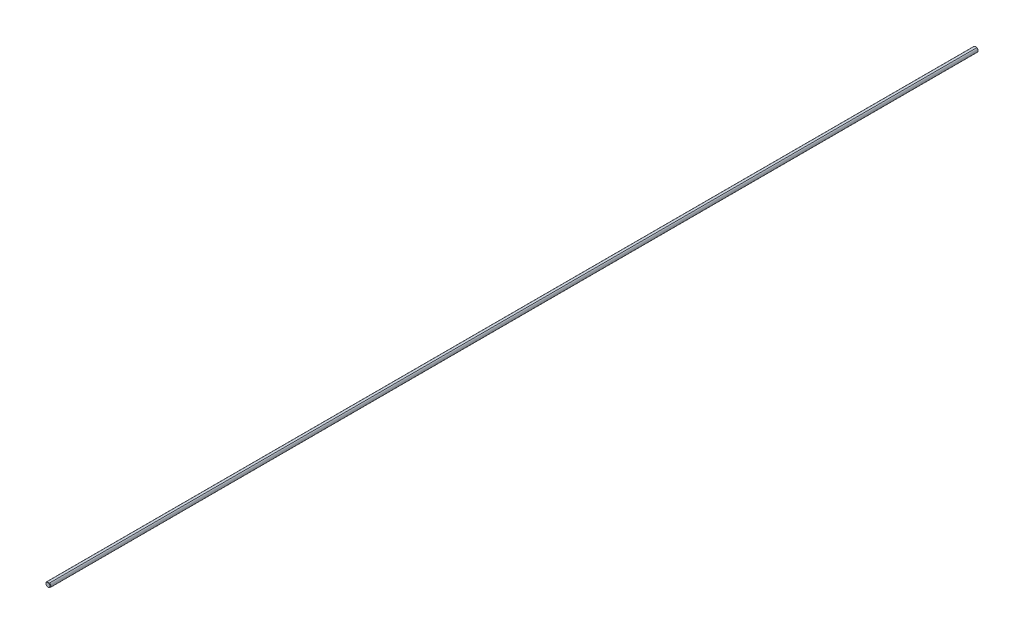
ISO-10303-21;
HEADER;
FILE_DESCRIPTION(('STEP AP214'),'2;1');
FILE_NAME('part.step','',(''),(''),'','','');
FILE_SCHEMA(('AUTOMOTIVE_DESIGN { 1 0 10303 214 1 1 1 1 }'));
ENDSEC;
DATA;
#1=APPLICATION_CONTEXT('core data for automotive mechanical design processes');
#2=APPLICATION_PROTOCOL_DEFINITION('international standard','automotive_design',2000,#1);
#3=PRODUCT_CONTEXT('',#1,'mechanical');
#4=PRODUCT('Part','Part','',(#3));
#5=PRODUCT_RELATED_PRODUCT_CATEGORY('part','',(#4));
#6=PRODUCT_DEFINITION_FORMATION('','',#4);
#7=PRODUCT_DEFINITION_CONTEXT('part definition',#1,'design');
#8=PRODUCT_DEFINITION('design','',#6,#7);
#9=PRODUCT_DEFINITION_SHAPE('','',#8);
#10=(LENGTH_UNIT() NAMED_UNIT(*) SI_UNIT(.MILLI.,.METRE.));
#11=(NAMED_UNIT(*) PLANE_ANGLE_UNIT() SI_UNIT($,.RADIAN.));
#12=(NAMED_UNIT(*) SI_UNIT($,.STERADIAN.) SOLID_ANGLE_UNIT());
#13=UNCERTAINTY_MEASURE_WITH_UNIT(LENGTH_MEASURE(1.E-05),#10,'distance_accuracy_value','');
#14=(GEOMETRIC_REPRESENTATION_CONTEXT(3) GLOBAL_UNCERTAINTY_ASSIGNED_CONTEXT((#13)) GLOBAL_UNIT_ASSIGNED_CONTEXT((#10,
#11,#12)) REPRESENTATION_CONTEXT('',''));
#15=CARTESIAN_POINT('',(0.,0.,0.));
#16=DIRECTION('',(0.,0.,1.));
#17=DIRECTION('',(1.,0.,0.));
#18=AXIS2_PLACEMENT_3D('',#15,#16,#17);
#19=CARTESIAN_POINT('',(0.,0.,609.6));
#20=DIRECTION('',(0.,0.,-1.));
#21=DIRECTION('',(-1.,0.,0.));
#22=AXIS2_PLACEMENT_3D('',#19,#20,#21);
#23=CYLINDRICAL_SURFACE('',#22,3.175);
#24=CARTESIAN_POINT('',(0.,0.,608.965));
#25=DIRECTION('',(0.,0.,1.));
#26=DIRECTION('',(1.,0.,0.));
#27=AXIS2_PLACEMENT_3D('',#24,#25,#26);
#28=CIRCLE('',#27,3.175);
#29=CARTESIAN_POINT('',(1.5875,2.74963065701559,608.965));
#30=VERTEX_POINT('',#29);
#31=CARTESIAN_POINT('',(-1.5875,2.74963065701559,608.965));
#32=VERTEX_POINT('',#31);
#33=EDGE_CURVE('E72',#30,#32,#28,.F.);
#34=ORIENTED_EDGE('',*,*,#33,.T.);
#35=DIRECTION('',(0.,0.,1.));
#36=VECTOR('',#35,1.);
#37=CARTESIAN_POINT('',(-1.5875,2.74963065701559,-609.6));
#38=LINE('',#37,#36);
#39=CARTESIAN_POINT('',(-1.5875,2.74963065701559,-608.964999999999));
#40=VERTEX_POINT('',#39);
#41=EDGE_CURVE('E50',#40,#32,#38,.T.);
#42=ORIENTED_EDGE('',*,*,#41,.F.);
#43=CARTESIAN_POINT('',(0.,0.,-608.964999999999));
#44=DIRECTION('',(0.,0.,1.));
#45=DIRECTION('',(1.,0.,0.));
#46=AXIS2_PLACEMENT_3D('',#43,#44,#45);
#47=CIRCLE('',#46,3.175);
#48=CARTESIAN_POINT('',(1.5875,2.74963065701559,-608.964999999999));
#49=VERTEX_POINT('',#48);
#50=EDGE_CURVE('E71',#40,#49,#47,.T.);
#51=ORIENTED_EDGE('',*,*,#50,.T.);
#52=DIRECTION('',(0.,0.,1.));
#53=VECTOR('',#52,1.);
#54=CARTESIAN_POINT('',(1.5875,2.74963065701559,-609.6));
#55=LINE('',#54,#53);
#56=EDGE_CURVE('E60',#49,#30,#55,.T.);
#57=ORIENTED_EDGE('',*,*,#56,.T.);
#58=EDGE_LOOP('',(#34,#42,#51,#57));
#59=FACE_BOUND('',#58,.T.);
#60=ADVANCED_FACE('F31',(#59),#23,.T.);
#61=CARTESIAN_POINT('',(0.,0.,609.6));
#62=DIRECTION('',(0.,0.,1.));
#63=DIRECTION('',(1.,0.,0.));
#64=AXIS2_PLACEMENT_3D('',#61,#62,#63);
#65=PLANE('',#64);
#66=CARTESIAN_POINT('',(0.,0.,609.6));
#67=DIRECTION('',(0.,0.,1.));
#68=DIRECTION('',(1.,0.,0.));
#69=AXIS2_PLACEMENT_3D('',#66,#67,#68);
#70=CIRCLE('',#69,2.54000000000043);
#71=CARTESIAN_POINT('',(2.54000000000043,0.,609.6));
#72=VERTEX_POINT('',#71);
#73=EDGE_CURVE('E44',#72,#72,#70,.T.);
#74=ORIENTED_EDGE('',*,*,#73,.T.);
#75=EDGE_LOOP('',(#74));
#76=FACE_BOUND('',#75,.T.);
#77=ADVANCED_FACE('F82',(#76),#65,.T.);
#78=CARTESIAN_POINT('',(0.,0.,-609.6));
#79=DIRECTION('',(0.,0.,1.));
#80=DIRECTION('',(1.,0.,0.));
#81=AXIS2_PLACEMENT_3D('',#78,#79,#80);
#82=PLANE('',#81);
#83=CARTESIAN_POINT('',(0.,0.,-609.6));
#84=DIRECTION('',(0.,0.,1.));
#85=DIRECTION('',(1.,0.,0.));
#86=AXIS2_PLACEMENT_3D('',#83,#84,#85);
#87=CIRCLE('',#86,2.53999999999932);
#88=CARTESIAN_POINT('',(2.53999999999932,0.,-609.6));
#89=VERTEX_POINT('',#88);
#90=EDGE_CURVE('E74',#89,#89,#87,.F.);
#91=ORIENTED_EDGE('',*,*,#90,.T.);
#92=EDGE_LOOP('',(#91));
#93=FACE_BOUND('',#92,.T.);
#94=ADVANCED_FACE('F90',(#93),#82,.F.);
#95=CARTESIAN_POINT('',(0.,0.,-608.964999999999));
#96=DIRECTION('',(0.,0.,1.));
#97=DIRECTION('',(1.,0.,0.));
#98=AXIS2_PLACEMENT_3D('',#95,#96,#97);
#99=CONICAL_SURFACE('',#98,3.175,0.785398163397331);
#100=CARTESIAN_POINT('',(-3.22896135223676,2.74963065701559,-607.898931718983));
#101=CARTESIAN_POINT('',(-3.15061649550055,2.74963065701559,-607.958566524545));
#102=CARTESIAN_POINT('',(-3.07184009651217,2.74963065701559,-608.017643482024));
#103=CARTESIAN_POINT('',(-2.91325130568777,2.74963065701559,-608.134429717618));
#104=CARTESIAN_POINT('',(-2.83343866506254,2.74963065701559,-608.192138657525));
#105=CARTESIAN_POINT('',(-2.6720206285271,2.74963065701559,-608.306347547804));
#106=CARTESIAN_POINT('',(-2.59040613970394,2.74963065701559,-608.362834689536));
#107=CARTESIAN_POINT('',(-2.42580311622133,2.74963065701559,-608.473763514334));
#108=CARTESIAN_POINT('',(-2.34281467809305,2.74963065701559,-608.528205340228));
#109=CARTESIAN_POINT('',(-2.17021447787204,2.74963065701559,-608.637773871165));
#110=CARTESIAN_POINT('',(-2.08050398524172,2.74963065701559,-608.692745835339));
#111=CARTESIAN_POINT('',(-1.89900904678674,2.74963065701559,-608.799146993197));
#112=CARTESIAN_POINT('',(-1.80722487525617,2.74963065701559,-608.850576651834));
#113=CARTESIAN_POINT('',(-1.62153760368914,2.74963065701559,-608.948814805051));
#114=CARTESIAN_POINT('',(-1.52764140922482,2.74963065701559,-608.995636250176));
#115=CARTESIAN_POINT('',(-1.3372470657209,2.74963065701559,-609.08360081534));
#116=CARTESIAN_POINT('',(-1.24075014112698,2.74963065701559,-609.124746553593));
#117=CARTESIAN_POINT('',(-1.0536474276074,2.74963065701559,-609.19655643723));
#118=CARTESIAN_POINT('',(-0.963276425588572,2.74963065701559,-609.227826043973));
#119=CARTESIAN_POINT('',(-0.780303735161089,2.74963065701559,-609.28312318735));
#120=CARTESIAN_POINT('',(-0.687701898779481,2.74963065701559,-609.307150242144));
#121=CARTESIAN_POINT('',(-0.502391431282919,2.74963065701559,-609.34628829084));
#122=CARTESIAN_POINT('',(-0.409716445146837,2.74963065701559,-609.361555954748));
#123=CARTESIAN_POINT('',(-0.223306330685383,2.74963065701559,-609.382868842029));
#124=CARTESIAN_POINT('',(-0.129571403437506,2.74963065701559,-609.388915786013));
#125=CARTESIAN_POINT('',(0.0543357559014986,2.74963065701559,-609.391309485248));
#126=CARTESIAN_POINT('',(0.144503242552168,2.74963065701559,-609.388028086227));
#127=CARTESIAN_POINT('',(0.324095543573175,2.74963065701559,-609.372781771963));
#128=CARTESIAN_POINT('',(0.413520286896612,2.74963065701559,-609.360816035481));
#129=CARTESIAN_POINT('',(0.592496066023778,2.74963065701559,-609.328661523536));
#130=CARTESIAN_POINT('',(0.682021177378701,2.74963065701559,-609.308330580175));
#131=CARTESIAN_POINT('',(0.859103373963476,2.74963065701559,-609.260545197953));
#132=CARTESIAN_POINT('',(0.946660601088428,2.74963065701559,-609.233091274501));
#133=CARTESIAN_POINT('',(1.21954622680417,2.74963065701559,-609.137129482189));
#134=CARTESIAN_POINT('',(1.40108594012607,2.74963065701559,-609.057809452736));
#135=CARTESIAN_POINT('',(1.66675889489785,2.74963065701559,-608.925553985225));
#136=CARTESIAN_POINT('',(1.75437488384936,2.74963065701559,-608.879152661123));
#137=CARTESIAN_POINT('',(1.92761951465508,2.74963065701559,-608.782769237767));
#138=CARTESIAN_POINT('',(2.01324850705358,2.74963065701559,-608.732787776575));
#139=CARTESIAN_POINT('',(2.17855184285628,2.74963065701559,-608.632513843306));
#140=CARTESIAN_POINT('',(2.25831097248689,2.74963065701559,-608.582359559039));
#141=CARTESIAN_POINT('',(2.41646118639878,2.74963065701559,-608.479928217762));
#142=CARTESIAN_POINT('',(2.49485216688054,2.74963065701559,-608.42765100068));
#143=CARTESIAN_POINT('',(2.64980987258497,2.74963065701559,-608.321783125056));
#144=CARTESIAN_POINT('',(2.72638621983822,2.74963065701559,-608.268206491774));
#145=CARTESIAN_POINT('',(2.87849044969021,2.74963065701559,-608.159627090017));
#146=CARTESIAN_POINT('',(2.95401861519112,2.74963065701559,-608.104624718309));
#147=CARTESIAN_POINT('',(3.02910770969471,2.74963065701559,-608.049038955583));
#148=B_SPLINE_CURVE_WITH_KNOTS('',3,(#100,#101,#102,#103,#104,#105,#106,#107,#108,#109,#110,
#111,#112,#113,#114,#115,#116,#117,#118,#119,#120,#121,#122,#123,#124,#125,#126,#127,#128,#129,
#130,#131,#132,#133,#134,#135,#136,#137,#138,#139,#140,#141,#142,#143,#144,#145,#146,#147),
.UNSPECIFIED.,.F.,.F.,(4,2,2,2,2,2,2,2,2,2,2,2,2,2,2,2,2,2,2,2,2,2,2,4),(0.,0.295383449271103,
0.590839178498622,0.888580871622715,1.18630173399044,1.50187785569719,1.81741247644308,
2.13203338294777,2.44650866534131,2.73314264689585,3.01979569373775,3.3011475826156,
3.58244696401957,3.85269226293418,4.12296312107106,4.39803055604312,4.67307809311779,
5.26557071241188,5.5629799848023,5.86033638333299,6.14295523590697,6.42559543796721,
6.70595195129898,6.98623126477032),.UNSPECIFIED.);
#149=EDGE_CURVE('E55',#49,#40,#148,.F.);
#150=ORIENTED_EDGE('',*,*,#149,.F.);
#151=ORIENTED_EDGE('',*,*,#50,.F.);
#152=EDGE_LOOP('',(#150,#151));
#153=FACE_BOUND('',#152,.T.);
#154=ORIENTED_EDGE('',*,*,#90,.F.);
#155=EDGE_LOOP('',(#154));
#156=FACE_BOUND('',#155,.T.);
#157=ADVANCED_FACE('F69',(#153,#156),#99,.T.);
#158=CARTESIAN_POINT('',(0.,0.,609.6));
#159=DIRECTION('',(0.,0.,-1.));
#160=DIRECTION('',(-1.,0.,0.));
#161=AXIS2_PLACEMENT_3D('',#158,#159,#160);
#162=CONICAL_SURFACE('',#161,2.54000000000043,0.785398163397419);
#163=CARTESIAN_POINT('',(-3.22896135223744,2.74963065701559,607.898931718984));
#164=CARTESIAN_POINT('',(-3.15061649550118,2.74963065701559,607.958566524546));
#165=CARTESIAN_POINT('',(-3.07184009651274,2.74963065701559,608.017643482025));
#166=CARTESIAN_POINT('',(-2.91325130568829,2.74963065701559,608.134429717619));
#167=CARTESIAN_POINT('',(-2.83343866506306,2.74963065701559,608.192138657526));
#168=CARTESIAN_POINT('',(-2.6720206285276,2.74963065701559,608.306347547805));
#169=CARTESIAN_POINT('',(-2.59040613970443,2.74963065701559,608.362834689537));
#170=CARTESIAN_POINT('',(-2.42580311622179,2.74963065701559,608.473763514335));
#171=CARTESIAN_POINT('',(-2.3428146780935,2.74963065701559,608.528205340229));
#172=CARTESIAN_POINT('',(-2.17021447787244,2.74963065701559,608.637773871166));
#173=CARTESIAN_POINT('',(-2.08050398524207,2.74963065701559,608.69274583534));
#174=CARTESIAN_POINT('',(-1.89900904678705,2.74963065701559,608.799146993198));
#175=CARTESIAN_POINT('',(-1.80722487525648,2.74963065701559,608.850576651835));
#176=CARTESIAN_POINT('',(-1.62153760368943,2.74963065701559,608.948814805052));
#177=CARTESIAN_POINT('',(-1.52764140922508,2.74963065701559,608.995636250177));
#178=CARTESIAN_POINT('',(-1.33724706572113,2.74963065701559,609.083600815341));
#179=CARTESIAN_POINT('',(-1.2407501411272,2.74963065701559,609.124746553595));
#180=CARTESIAN_POINT('',(-1.05364742760759,2.74963065701559,609.196556437231));
#181=CARTESIAN_POINT('',(-0.963276425588743,2.74963065701559,609.227826043974));
#182=CARTESIAN_POINT('',(-0.780303735161212,2.74963065701559,609.283123187351));
#183=CARTESIAN_POINT('',(-0.687701898779576,2.74963065701559,609.307150242145));
#184=CARTESIAN_POINT('',(-0.502391431282961,2.74963065701559,609.346288290842));
#185=CARTESIAN_POINT('',(-0.409716445146855,2.74963065701559,609.361555954749));
#186=CARTESIAN_POINT('',(-0.223306330685347,2.74963065701559,609.38286884203));
#187=CARTESIAN_POINT('',(-0.12957140343744,2.74963065701559,609.388915786015));
#188=CARTESIAN_POINT('',(0.0543357559016078,2.74963065701559,609.391309485249));
#189=CARTESIAN_POINT('',(0.144503242552291,2.74963065701559,609.388028086228));
#190=CARTESIAN_POINT('',(0.324095543573328,2.74963065701559,609.372781771964));
#191=CARTESIAN_POINT('',(0.41352028689678,2.74963065701559,609.360816035482));
#192=CARTESIAN_POINT('',(0.592496066023975,2.74963065701559,609.328661523537));
#193=CARTESIAN_POINT('',(0.682021177378911,2.74963065701559,609.308330580176));
#194=CARTESIAN_POINT('',(0.859103373963713,2.74963065701559,609.260545197954));
#195=CARTESIAN_POINT('',(0.946660601088681,2.74963065701559,609.233091274502));
#196=CARTESIAN_POINT('',(1.2195462268045,2.74963065701559,609.13712948219));
#197=CARTESIAN_POINT('',(1.40108594012646,2.74963065701559,609.057809452737));
#198=CARTESIAN_POINT('',(1.66675889489837,2.74963065701559,608.925553985226));
#199=CARTESIAN_POINT('',(1.75437488384995,2.74963065701559,608.879152661124));
#200=CARTESIAN_POINT('',(1.92761951465577,2.74963065701559,608.782769237768));
#201=CARTESIAN_POINT('',(2.0132485070543,2.74963065701559,608.732787776576));
#202=CARTESIAN_POINT('',(2.17855184285703,2.74963065701559,608.632513843307));
#203=CARTESIAN_POINT('',(2.25831097248764,2.74963065701559,608.58235955904));
#204=CARTESIAN_POINT('',(2.41646118639959,2.74963065701559,608.479928217763));
#205=CARTESIAN_POINT('',(2.49485216688141,2.74963065701559,608.427651000681));
#206=CARTESIAN_POINT('',(2.64980987258591,2.74963065701559,608.321783125056));
#207=CARTESIAN_POINT('',(2.72638621983917,2.74963065701559,608.268206491774));
#208=CARTESIAN_POINT('',(2.87849044969122,2.74963065701559,608.159627090018));
#209=CARTESIAN_POINT('',(2.95401861519216,2.74963065701559,608.10462471831));
#210=CARTESIAN_POINT('',(3.02910770969582,2.74963065701559,608.049038955583));
#211=B_SPLINE_CURVE_WITH_KNOTS('',3,(#163,#164,#165,#166,#167,#168,#169,#170,#171,#172,#173,
#174,#175,#176,#177,#178,#179,#180,#181,#182,#183,#184,#185,#186,#187,#188,#189,#190,#191,#192,
#193,#194,#195,#196,#197,#198,#199,#200,#201,#202,#203,#204,#205,#206,#207,#208,#209,#210),
.UNSPECIFIED.,.F.,.F.,(4,2,2,2,2,2,2,2,2,2,2,2,2,2,2,2,2,2,2,2,2,2,2,4),(0.,0.295383449271299,
0.590839178498825,0.888580871622958,1.18630173399071,1.50187785569755,1.81741247644353,
2.13203338294826,2.44650866534183,2.73314264689643,3.0197956937384,3.30114758261636,
3.58244696402039,3.85269226293506,4.12296312107198,4.39803055604408,4.67307809311879,
5.26557071241309,5.56297998480375,5.8603363833345,6.14295523590857,6.42559543796899,
6.70595195130088,6.98623126477232),.UNSPECIFIED.);
#212=EDGE_CURVE('E11',#32,#30,#211,.T.);
#213=ORIENTED_EDGE('',*,*,#212,.F.);
#214=ORIENTED_EDGE('',*,*,#33,.F.);
#215=EDGE_LOOP('',(#213,#214));
#216=FACE_BOUND('',#215,.T.);
#217=ORIENTED_EDGE('',*,*,#73,.F.);
#218=EDGE_LOOP('',(#217));
#219=FACE_BOUND('',#218,.T.);
#220=ADVANCED_FACE('F33',(#216,#219),#162,.T.);
#221=CARTESIAN_POINT('',(-1.5875,2.74963065701559,-609.6));
#222=DIRECTION('',(0.,-1.,0.));
#223=DIRECTION('',(0.,0.,-1.));
#224=AXIS2_PLACEMENT_3D('',#221,#222,#223);
#225=PLANE('',#224);
#226=ORIENTED_EDGE('',*,*,#149,.T.);
#227=ORIENTED_EDGE('',*,*,#41,.T.);
#228=ORIENTED_EDGE('',*,*,#212,.T.);
#229=ORIENTED_EDGE('',*,*,#56,.F.);
#230=EDGE_LOOP('',(#226,#227,#228,#229));
#231=FACE_BOUND('',#230,.T.);
#232=ADVANCED_FACE('F61',(#231),#225,.F.);
#233=CLOSED_SHELL('',(#60,#77,#94,#157,#220,#232));
#234=MANIFOLD_SOLID_BREP('B2',#233);
#235=ADVANCED_BREP_SHAPE_REPRESENTATION('',(#18,#234),#14);
#236=SHAPE_DEFINITION_REPRESENTATION(#9,#235);
ENDSEC;
END-ISO-10303-21;
